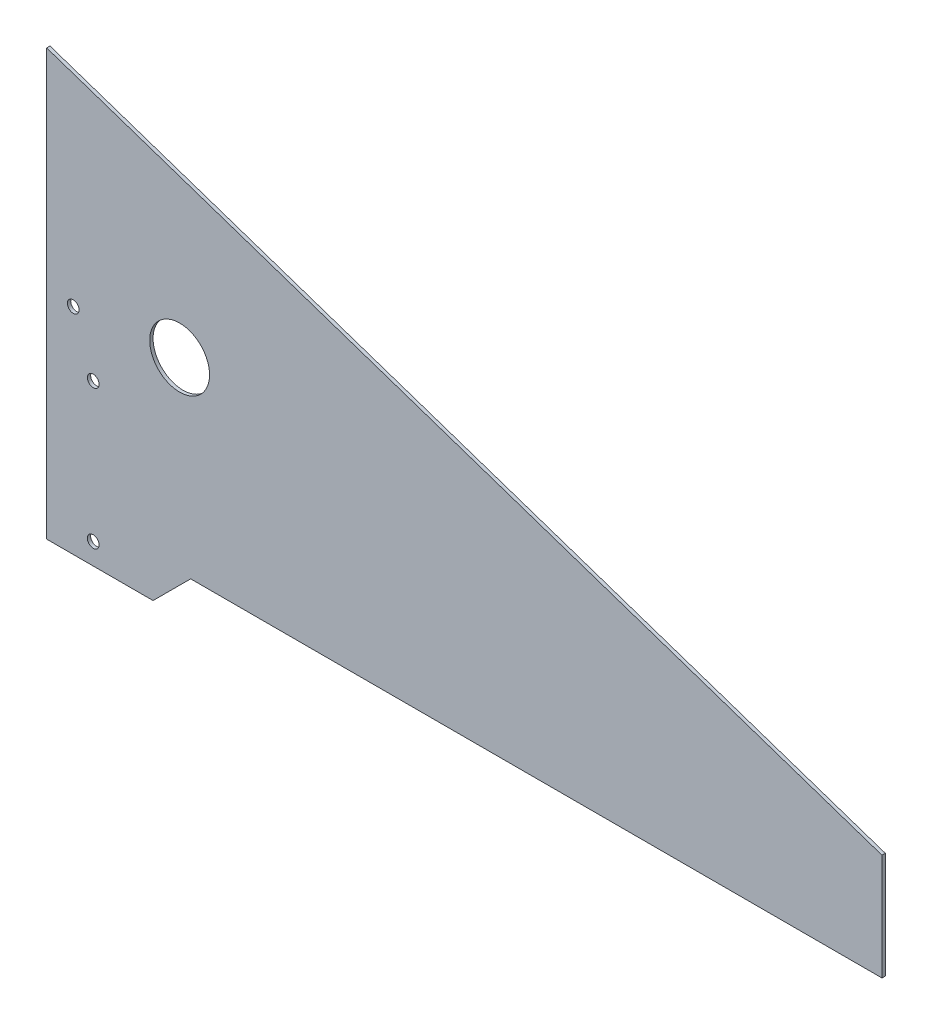
ISO-10303-21;
HEADER;
FILE_DESCRIPTION(('STEP AP214'),'2;1');
FILE_NAME('part.step','',(''),(''),'','','');
FILE_SCHEMA(('AUTOMOTIVE_DESIGN { 1 0 10303 214 1 1 1 1 }'));
ENDSEC;
DATA;
#1=APPLICATION_CONTEXT('core data for automotive mechanical design processes');
#2=APPLICATION_PROTOCOL_DEFINITION('international standard','automotive_design',2000,#1);
#3=PRODUCT_CONTEXT('',#1,'mechanical');
#4=PRODUCT('Part','Part','',(#3));
#5=PRODUCT_RELATED_PRODUCT_CATEGORY('part','',(#4));
#6=PRODUCT_DEFINITION_FORMATION('','',#4);
#7=PRODUCT_DEFINITION_CONTEXT('part definition',#1,'design');
#8=PRODUCT_DEFINITION('design','',#6,#7);
#9=PRODUCT_DEFINITION_SHAPE('','',#8);
#10=(LENGTH_UNIT() NAMED_UNIT(*) SI_UNIT(.MILLI.,.METRE.));
#11=(NAMED_UNIT(*) PLANE_ANGLE_UNIT() SI_UNIT($,.RADIAN.));
#12=(NAMED_UNIT(*) SI_UNIT($,.STERADIAN.) SOLID_ANGLE_UNIT());
#13=UNCERTAINTY_MEASURE_WITH_UNIT(LENGTH_MEASURE(1.E-05),#10,'distance_accuracy_value','');
#14=(GEOMETRIC_REPRESENTATION_CONTEXT(3) GLOBAL_UNCERTAINTY_ASSIGNED_CONTEXT((#13)) GLOBAL_UNIT_ASSIGNED_CONTEXT((#10,
#11,#12)) REPRESENTATION_CONTEXT('',''));
#15=CARTESIAN_POINT('',(0.,0.,0.));
#16=DIRECTION('',(0.,0.,1.));
#17=DIRECTION('',(1.,0.,0.));
#18=AXIS2_PLACEMENT_3D('',#15,#16,#17);
#19=CARTESIAN_POINT('',(50.8,0.,1.5875));
#20=DIRECTION('',(0.,1.,0.));
#21=DIRECTION('',(0.,0.,1.));
#22=AXIS2_PLACEMENT_3D('',#19,#20,#21);
#23=PLANE('',#22);
#24=DIRECTION('',(1.,0.,0.));
#25=VECTOR('',#24,1.);
#26=CARTESIAN_POINT('',(50.8,0.,0.));
#27=LINE('',#26,#25);
#28=CARTESIAN_POINT('',(0.,0.,0.));
#29=VERTEX_POINT('',#28);
#30=CARTESIAN_POINT('',(50.8,0.,0.));
#31=VERTEX_POINT('',#30);
#32=EDGE_CURVE('E140',#29,#31,#27,.T.);
#33=ORIENTED_EDGE('',*,*,#32,.T.);
#34=DIRECTION('',(0.,0.,-1.));
#35=VECTOR('',#34,1.);
#36=CARTESIAN_POINT('',(50.8,0.,1.5875));
#37=LINE('',#36,#35);
#38=CARTESIAN_POINT('',(50.8,0.,1.5875));
#39=VERTEX_POINT('',#38);
#40=EDGE_CURVE('E11',#39,#31,#37,.T.);
#41=ORIENTED_EDGE('',*,*,#40,.F.);
#42=DIRECTION('',(1.,0.,0.));
#43=VECTOR('',#42,1.);
#44=CARTESIAN_POINT('',(50.8,0.,1.5875));
#45=LINE('',#44,#43);
#46=CARTESIAN_POINT('',(0.,0.,1.5875));
#47=VERTEX_POINT('',#46);
#48=EDGE_CURVE('E155',#47,#39,#45,.T.);
#49=ORIENTED_EDGE('',*,*,#48,.F.);
#50=DIRECTION('',(0.,0.,-1.));
#51=VECTOR('',#50,1.);
#52=CARTESIAN_POINT('',(0.,0.,1.5875));
#53=LINE('',#52,#51);
#54=EDGE_CURVE('E136',#47,#29,#53,.T.);
#55=ORIENTED_EDGE('',*,*,#54,.T.);
#56=EDGE_LOOP('',(#33,#41,#49,#55));
#57=FACE_BOUND('',#56,.T.);
#58=ADVANCED_FACE('F41',(#57),#23,.F.);
#59=CARTESIAN_POINT('',(68.7605122421383,17.9605122421383,1.5875));
#60=DIRECTION('',(-0.707106781186549,0.707106781186546,0.));
#61=DIRECTION('',(-0.707106781186546,-0.707106781186549,0.));
#62=AXIS2_PLACEMENT_3D('',#59,#60,#61);
#63=PLANE('',#62);
#64=DIRECTION('',(0.707106781186546,0.707106781186549,0.));
#65=VECTOR('',#64,1.);
#66=CARTESIAN_POINT('',(68.7605122421383,17.9605122421383,0.));
#67=LINE('',#66,#65);
#68=CARTESIAN_POINT('',(68.7605122421383,17.9605122421383,0.));
#69=VERTEX_POINT('',#68);
#70=EDGE_CURVE('E144',#31,#69,#67,.T.);
#71=ORIENTED_EDGE('',*,*,#70,.T.);
#72=DIRECTION('',(0.,0.,-1.));
#73=VECTOR('',#72,1.);
#74=CARTESIAN_POINT('',(68.7605122421383,17.9605122421383,1.5875));
#75=LINE('',#74,#73);
#76=CARTESIAN_POINT('',(68.7605122421383,17.9605122421383,1.5875));
#77=VERTEX_POINT('',#76);
#78=EDGE_CURVE('E50',#77,#69,#75,.T.);
#79=ORIENTED_EDGE('',*,*,#78,.F.);
#80=DIRECTION('',(0.707106781186546,0.707106781186549,0.));
#81=VECTOR('',#80,1.);
#82=CARTESIAN_POINT('',(68.7605122421383,17.9605122421383,1.5875));
#83=LINE('',#82,#81);
#84=EDGE_CURVE('E103',#39,#77,#83,.T.);
#85=ORIENTED_EDGE('',*,*,#84,.F.);
#86=ORIENTED_EDGE('',*,*,#40,.T.);
#87=EDGE_LOOP('',(#71,#79,#85,#86));
#88=FACE_BOUND('',#87,.T.);
#89=ADVANCED_FACE('F186',(#88),#63,.F.);
#90=CARTESIAN_POINT('',(398.960512242138,17.9605122421385,1.5875));
#91=DIRECTION('',(0.,1.,0.));
#92=DIRECTION('',(-1.,0.,0.));
#93=AXIS2_PLACEMENT_3D('',#90,#91,#92);
#94=PLANE('',#93);
#95=DIRECTION('',(1.,0.,0.));
#96=VECTOR('',#95,1.);
#97=CARTESIAN_POINT('',(398.960512242138,17.9605122421385,0.));
#98=LINE('',#97,#96);
#99=CARTESIAN_POINT('',(398.960512242138,17.9605122421385,0.));
#100=VERTEX_POINT('',#99);
#101=EDGE_CURVE('E148',#69,#100,#98,.T.);
#102=ORIENTED_EDGE('',*,*,#101,.T.);
#103=DIRECTION('',(0.,0.,-1.));
#104=VECTOR('',#103,1.);
#105=CARTESIAN_POINT('',(398.960512242138,17.9605122421385,1.5875));
#106=LINE('',#105,#104);
#107=CARTESIAN_POINT('',(398.960512242138,17.9605122421385,1.5875));
#108=VERTEX_POINT('',#107);
#109=EDGE_CURVE('E127',#108,#100,#106,.T.);
#110=ORIENTED_EDGE('',*,*,#109,.F.);
#111=DIRECTION('',(1.,0.,0.));
#112=VECTOR('',#111,1.);
#113=CARTESIAN_POINT('',(398.960512242138,17.9605122421385,1.5875));
#114=LINE('',#113,#112);
#115=EDGE_CURVE('E117',#77,#108,#114,.T.);
#116=ORIENTED_EDGE('',*,*,#115,.F.);
#117=ORIENTED_EDGE('',*,*,#78,.T.);
#118=EDGE_LOOP('',(#102,#110,#116,#117));
#119=FACE_BOUND('',#118,.T.);
#120=ADVANCED_FACE('F167',(#119),#94,.F.);
#121=CARTESIAN_POINT('',(398.960512242138,68.7605122421385,1.5875));
#122=DIRECTION('',(-1.,0.,0.));
#123=DIRECTION('',(0.,0.,1.));
#124=AXIS2_PLACEMENT_3D('',#121,#122,#123);
#125=PLANE('',#124);
#126=DIRECTION('',(0.,1.,0.));
#127=VECTOR('',#126,1.);
#128=CARTESIAN_POINT('',(398.960512242138,68.7605122421385,0.));
#129=LINE('',#128,#127);
#130=CARTESIAN_POINT('',(398.960512242138,68.7605122421385,0.));
#131=VERTEX_POINT('',#130);
#132=EDGE_CURVE('E126',#100,#131,#129,.T.);
#133=ORIENTED_EDGE('',*,*,#132,.T.);
#134=DIRECTION('',(0.,0.,-1.));
#135=VECTOR('',#134,1.);
#136=CARTESIAN_POINT('',(398.960512242138,68.7605122421385,1.5875));
#137=LINE('',#136,#135);
#138=CARTESIAN_POINT('',(398.960512242138,68.7605122421385,1.5875));
#139=VERTEX_POINT('',#138);
#140=EDGE_CURVE('E123',#139,#131,#137,.T.);
#141=ORIENTED_EDGE('',*,*,#140,.F.);
#142=DIRECTION('',(0.,1.,0.));
#143=VECTOR('',#142,1.);
#144=CARTESIAN_POINT('',(398.960512242138,68.7605122421385,1.5875));
#145=LINE('',#144,#143);
#146=EDGE_CURVE('E111',#108,#139,#145,.T.);
#147=ORIENTED_EDGE('',*,*,#146,.F.);
#148=ORIENTED_EDGE('',*,*,#109,.T.);
#149=EDGE_LOOP('',(#133,#141,#147,#148));
#150=FACE_BOUND('',#149,.T.);
#151=ADVANCED_FACE('F124',(#150),#125,.F.);
#152=CARTESIAN_POINT('',(0.,203.2,1.5875));
#153=DIRECTION('',(-0.319331478496767,-0.947643079878215,0.));
#154=DIRECTION('',(0.947643079878215,-0.319331478496767,0.));
#155=AXIS2_PLACEMENT_3D('',#152,#153,#154);
#156=PLANE('',#155);
#157=DIRECTION('',(-0.947643079878215,0.319331478496767,0.));
#158=VECTOR('',#157,1.);
#159=CARTESIAN_POINT('',(0.,203.2,0.));
#160=LINE('',#159,#158);
#161=CARTESIAN_POINT('',(0.,203.2,0.));
#162=VERTEX_POINT('',#161);
#163=EDGE_CURVE('E87',#131,#162,#160,.T.);
#164=ORIENTED_EDGE('',*,*,#163,.T.);
#165=DIRECTION('',(0.,0.,-1.));
#166=VECTOR('',#165,1.);
#167=CARTESIAN_POINT('',(0.,203.2,1.5875));
#168=LINE('',#167,#166);
#169=CARTESIAN_POINT('',(0.,203.2,1.5875));
#170=VERTEX_POINT('',#169);
#171=EDGE_CURVE('E128',#170,#162,#168,.T.);
#172=ORIENTED_EDGE('',*,*,#171,.F.);
#173=DIRECTION('',(-0.947643079878215,0.319331478496767,0.));
#174=VECTOR('',#173,1.);
#175=CARTESIAN_POINT('',(0.,203.2,1.5875));
#176=LINE('',#175,#174);
#177=EDGE_CURVE('E115',#139,#170,#176,.T.);
#178=ORIENTED_EDGE('',*,*,#177,.F.);
#179=ORIENTED_EDGE('',*,*,#140,.T.);
#180=EDGE_LOOP('',(#164,#172,#178,#179));
#181=FACE_BOUND('',#180,.T.);
#182=ADVANCED_FACE('F130',(#181),#156,.F.);
#183=CARTESIAN_POINT('',(0.,0.,1.5875));
#184=DIRECTION('',(1.,0.,0.));
#185=DIRECTION('',(0.,0.,-1.));
#186=AXIS2_PLACEMENT_3D('',#183,#184,#185);
#187=PLANE('',#186);
#188=DIRECTION('',(0.,-1.,0.));
#189=VECTOR('',#188,1.);
#190=CARTESIAN_POINT('',(0.,0.,0.));
#191=LINE('',#190,#189);
#192=EDGE_CURVE('E94',#162,#29,#191,.T.);
#193=ORIENTED_EDGE('',*,*,#192,.T.);
#194=ORIENTED_EDGE('',*,*,#54,.F.);
#195=DIRECTION('',(0.,-1.,0.));
#196=VECTOR('',#195,1.);
#197=CARTESIAN_POINT('',(0.,0.,1.5875));
#198=LINE('',#197,#196);
#199=EDGE_CURVE('E60',#170,#47,#198,.T.);
#200=ORIENTED_EDGE('',*,*,#199,.F.);
#201=ORIENTED_EDGE('',*,*,#171,.T.);
#202=EDGE_LOOP('',(#193,#194,#200,#201));
#203=FACE_BOUND('',#202,.T.);
#204=ADVANCED_FACE('F174',(#203),#187,.F.);
#205=CARTESIAN_POINT('',(0.,0.,1.5875));
#206=DIRECTION('',(0.,0.,-1.));
#207=DIRECTION('',(-1.,0.,0.));
#208=AXIS2_PLACEMENT_3D('',#205,#206,#207);
#209=PLANE('',#208);
#210=CARTESIAN_POINT('',(63.5,106.860512242138,1.5875));
#211=DIRECTION('',(0.,0.,1.));
#212=DIRECTION('',(1.,0.,0.));
#213=AXIS2_PLACEMENT_3D('',#210,#211,#212);
#214=CIRCLE('',#213,14.2875);
#215=CARTESIAN_POINT('',(77.7875,106.860512242138,1.5875));
#216=VERTEX_POINT('',#215);
#217=EDGE_CURVE('E301',#216,#216,#214,.T.);
#218=ORIENTED_EDGE('',*,*,#217,.F.);
#219=EDGE_LOOP('',(#218));
#220=FACE_BOUND('',#219,.T.);
#221=CARTESIAN_POINT('',(12.7000000000014,102.542512242133,1.5875));
#222=DIRECTION('',(0.,0.,-1.));
#223=DIRECTION('',(-1.,0.,0.));
#224=AXIS2_PLACEMENT_3D('',#221,#222,#223);
#225=CIRCLE('',#224,2.8067);
#226=CARTESIAN_POINT('',(9.89330000000143,102.542512242133,1.5875));
#227=VERTEX_POINT('',#226);
#228=EDGE_CURVE('E290',#227,#227,#225,.T.);
#229=ORIENTED_EDGE('',*,*,#228,.T.);
#230=EDGE_LOOP('',(#229));
#231=FACE_BOUND('',#230,.T.);
#232=CARTESIAN_POINT('',(22.225,76.5735521081451,1.5875));
#233=DIRECTION('',(0.,0.,-1.));
#234=DIRECTION('',(-1.,0.,0.));
#235=AXIS2_PLACEMENT_3D('',#232,#233,#234);
#236=CIRCLE('',#235,2.8067);
#237=CARTESIAN_POINT('',(19.4183,76.5735521081451,1.5875));
#238=VERTEX_POINT('',#237);
#239=EDGE_CURVE('E276',#238,#238,#236,.T.);
#240=ORIENTED_EDGE('',*,*,#239,.T.);
#241=EDGE_LOOP('',(#240));
#242=FACE_BOUND('',#241,.T.);
#243=CARTESIAN_POINT('',(22.225,10.1474723761316,1.5875));
#244=DIRECTION('',(0.,0.,-1.));
#245=DIRECTION('',(-1.,0.,0.));
#246=AXIS2_PLACEMENT_3D('',#243,#244,#245);
#247=CIRCLE('',#246,2.8067);
#248=CARTESIAN_POINT('',(19.4183,10.1474723761316,1.5875));
#249=VERTEX_POINT('',#248);
#250=EDGE_CURVE('E145',#249,#249,#247,.T.);
#251=ORIENTED_EDGE('',*,*,#250,.T.);
#252=EDGE_LOOP('',(#251));
#253=FACE_BOUND('',#252,.T.);
#254=ORIENTED_EDGE('',*,*,#48,.T.);
#255=ORIENTED_EDGE('',*,*,#84,.T.);
#256=ORIENTED_EDGE('',*,*,#115,.T.);
#257=ORIENTED_EDGE('',*,*,#146,.T.);
#258=ORIENTED_EDGE('',*,*,#177,.T.);
#259=ORIENTED_EDGE('',*,*,#199,.T.);
#260=EDGE_LOOP('',(#254,#255,#256,#257,#258,#259));
#261=FACE_BOUND('',#260,.T.);
#262=ADVANCED_FACE('F113',(#220,#231,#242,#253,#261),#209,.F.);
#263=CARTESIAN_POINT('',(0.,0.,0.));
#264=DIRECTION('',(0.,0.,-1.));
#265=DIRECTION('',(-1.,0.,0.));
#266=AXIS2_PLACEMENT_3D('',#263,#264,#265);
#267=PLANE('',#266);
#268=CARTESIAN_POINT('',(63.5,106.860512242138,0.));
#269=DIRECTION('',(0.,0.,1.));
#270=DIRECTION('',(1.,0.,0.));
#271=AXIS2_PLACEMENT_3D('',#268,#269,#270);
#272=CIRCLE('',#271,14.2875);
#273=CARTESIAN_POINT('',(77.7875,106.860512242138,0.));
#274=VERTEX_POINT('',#273);
#275=EDGE_CURVE('E295',#274,#274,#272,.T.);
#276=ORIENTED_EDGE('',*,*,#275,.T.);
#277=EDGE_LOOP('',(#276));
#278=FACE_BOUND('',#277,.T.);
#279=CARTESIAN_POINT('',(12.7000000000014,102.542512242133,0.));
#280=DIRECTION('',(0.,0.,-1.));
#281=DIRECTION('',(-1.,0.,0.));
#282=AXIS2_PLACEMENT_3D('',#279,#280,#281);
#283=CIRCLE('',#282,2.80669999999999);
#284=CARTESIAN_POINT('',(9.89330000000144,102.542512242133,0.));
#285=VERTEX_POINT('',#284);
#286=EDGE_CURVE('E292',#285,#285,#283,.T.);
#287=ORIENTED_EDGE('',*,*,#286,.F.);
#288=EDGE_LOOP('',(#287));
#289=FACE_BOUND('',#288,.T.);
#290=CARTESIAN_POINT('',(22.225,76.5735521081451,0.));
#291=DIRECTION('',(0.,0.,-1.));
#292=DIRECTION('',(-1.,0.,0.));
#293=AXIS2_PLACEMENT_3D('',#290,#291,#292);
#294=CIRCLE('',#293,2.80669999999999);
#295=CARTESIAN_POINT('',(19.4183,76.5735521081451,0.));
#296=VERTEX_POINT('',#295);
#297=EDGE_CURVE('E282',#296,#296,#294,.T.);
#298=ORIENTED_EDGE('',*,*,#297,.F.);
#299=EDGE_LOOP('',(#298));
#300=FACE_BOUND('',#299,.T.);
#301=CARTESIAN_POINT('',(22.225,10.1474723761316,0.));
#302=DIRECTION('',(0.,0.,-1.));
#303=DIRECTION('',(-1.,0.,0.));
#304=AXIS2_PLACEMENT_3D('',#301,#302,#303);
#305=CIRCLE('',#304,2.80669999999999);
#306=CARTESIAN_POINT('',(19.4183,10.1474723761316,0.));
#307=VERTEX_POINT('',#306);
#308=EDGE_CURVE('E273',#307,#307,#305,.T.);
#309=ORIENTED_EDGE('',*,*,#308,.F.);
#310=EDGE_LOOP('',(#309));
#311=FACE_BOUND('',#310,.T.);
#312=ORIENTED_EDGE('',*,*,#32,.F.);
#313=ORIENTED_EDGE('',*,*,#192,.F.);
#314=ORIENTED_EDGE('',*,*,#163,.F.);
#315=ORIENTED_EDGE('',*,*,#132,.F.);
#316=ORIENTED_EDGE('',*,*,#101,.F.);
#317=ORIENTED_EDGE('',*,*,#70,.F.);
#318=EDGE_LOOP('',(#312,#313,#314,#315,#316,#317));
#319=FACE_BOUND('',#318,.T.);
#320=ADVANCED_FACE('F170',(#278,#289,#300,#311,#319),#267,.T.);
#321=CARTESIAN_POINT('',(22.225,10.1474723761316,0.));
#322=DIRECTION('',(0.,0.,-1.));
#323=DIRECTION('',(-1.,0.,0.));
#324=AXIS2_PLACEMENT_3D('',#321,#322,#323);
#325=CYLINDRICAL_SURFACE('',#324,2.80669999999999);
#326=ORIENTED_EDGE('',*,*,#250,.F.);
#327=EDGE_LOOP('',(#326));
#328=FACE_BOUND('',#327,.T.);
#329=ORIENTED_EDGE('',*,*,#308,.T.);
#330=EDGE_LOOP('',(#329));
#331=FACE_BOUND('',#330,.T.);
#332=ADVANCED_FACE('F229',(#328,#331),#325,.F.);
#333=CARTESIAN_POINT('',(22.225,76.5735521081451,0.));
#334=DIRECTION('',(0.,0.,-1.));
#335=DIRECTION('',(-1.,0.,0.));
#336=AXIS2_PLACEMENT_3D('',#333,#334,#335);
#337=CYLINDRICAL_SURFACE('',#336,2.80669999999999);
#338=ORIENTED_EDGE('',*,*,#239,.F.);
#339=EDGE_LOOP('',(#338));
#340=FACE_BOUND('',#339,.T.);
#341=ORIENTED_EDGE('',*,*,#297,.T.);
#342=EDGE_LOOP('',(#341));
#343=FACE_BOUND('',#342,.T.);
#344=ADVANCED_FACE('F245',(#340,#343),#337,.F.);
#345=CARTESIAN_POINT('',(12.7000000000014,102.542512242133,0.));
#346=DIRECTION('',(0.,0.,-1.));
#347=DIRECTION('',(-1.,0.,0.));
#348=AXIS2_PLACEMENT_3D('',#345,#346,#347);
#349=CYLINDRICAL_SURFACE('',#348,2.80669999999999);
#350=ORIENTED_EDGE('',*,*,#228,.F.);
#351=EDGE_LOOP('',(#350));
#352=FACE_BOUND('',#351,.T.);
#353=ORIENTED_EDGE('',*,*,#286,.T.);
#354=EDGE_LOOP('',(#353));
#355=FACE_BOUND('',#354,.T.);
#356=ADVANCED_FACE('F212',(#352,#355),#349,.F.);
#357=CARTESIAN_POINT('',(63.5,106.860512242138,0.));
#358=DIRECTION('',(0.,0.,1.));
#359=DIRECTION('',(1.,0.,0.));
#360=AXIS2_PLACEMENT_3D('',#357,#358,#359);
#361=CYLINDRICAL_SURFACE('',#360,14.2875);
#362=ORIENTED_EDGE('',*,*,#275,.F.);
#363=EDGE_LOOP('',(#362));
#364=FACE_BOUND('',#363,.T.);
#365=ORIENTED_EDGE('',*,*,#217,.T.);
#366=EDGE_LOOP('',(#365));
#367=FACE_BOUND('',#366,.T.);
#368=ADVANCED_FACE('F209',(#364,#367),#361,.F.);
#369=CLOSED_SHELL('',(#58,#89,#120,#151,#182,#204,#262,#320,#332,#344,#356,#368));
#370=MANIFOLD_SOLID_BREP('B2',#369);
#371=ADVANCED_BREP_SHAPE_REPRESENTATION('',(#18,#370),#14);
#372=SHAPE_DEFINITION_REPRESENTATION(#9,#371);
ENDSEC;
END-ISO-10303-21;
